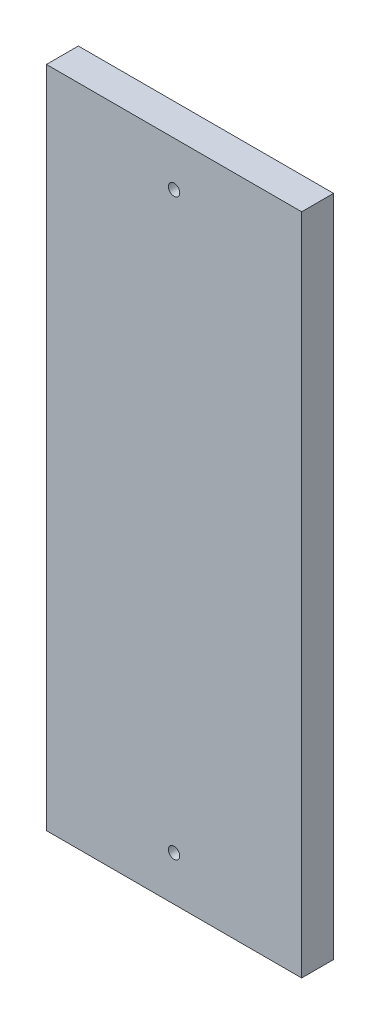
ISO-10303-21;
HEADER;
FILE_DESCRIPTION(('STEP AP214'),'2;1');
FILE_NAME('part.step','',(''),(''),'','','');
FILE_SCHEMA(('AUTOMOTIVE_DESIGN { 1 0 10303 214 1 1 1 1 }'));
ENDSEC;
DATA;
#1=APPLICATION_CONTEXT('core data for automotive mechanical design processes');
#2=APPLICATION_PROTOCOL_DEFINITION('international standard','automotive_design',2000,#1);
#3=PRODUCT_CONTEXT('',#1,'mechanical');
#4=PRODUCT('Part','Part','',(#3));
#5=PRODUCT_RELATED_PRODUCT_CATEGORY('part','',(#4));
#6=PRODUCT_DEFINITION_FORMATION('','',#4);
#7=PRODUCT_DEFINITION_CONTEXT('part definition',#1,'design');
#8=PRODUCT_DEFINITION('design','',#6,#7);
#9=PRODUCT_DEFINITION_SHAPE('','',#8);
#10=(LENGTH_UNIT() NAMED_UNIT(*) SI_UNIT(.MILLI.,.METRE.));
#11=(NAMED_UNIT(*) PLANE_ANGLE_UNIT() SI_UNIT($,.RADIAN.));
#12=(NAMED_UNIT(*) SI_UNIT($,.STERADIAN.) SOLID_ANGLE_UNIT());
#13=UNCERTAINTY_MEASURE_WITH_UNIT(LENGTH_MEASURE(1.E-05),#10,'distance_accuracy_value','');
#14=(GEOMETRIC_REPRESENTATION_CONTEXT(3) GLOBAL_UNCERTAINTY_ASSIGNED_CONTEXT((#13)) GLOBAL_UNIT_ASSIGNED_CONTEXT((#10,
#11,#12)) REPRESENTATION_CONTEXT('',''));
#15=CARTESIAN_POINT('',(0.,0.,0.));
#16=DIRECTION('',(0.,0.,1.));
#17=DIRECTION('',(1.,0.,0.));
#18=AXIS2_PLACEMENT_3D('',#15,#16,#17);
#19=CARTESIAN_POINT('',(25.4000000000001,132.08,-3.175));
#20=DIRECTION('',(-1.,0.,0.));
#21=DIRECTION('',(0.,0.,1.));
#22=AXIS2_PLACEMENT_3D('',#19,#20,#21);
#23=PLANE('',#22);
#24=DIRECTION('',(0.,0.,-1.));
#25=VECTOR('',#24,1.);
#26=CARTESIAN_POINT('',(25.4000000000001,0.,-3.175));
#27=LINE('',#26,#25);
#28=CARTESIAN_POINT('',(25.4000000000001,0.,3.17499999999999));
#29=VERTEX_POINT('',#28);
#30=CARTESIAN_POINT('',(25.4000000000001,0.,-3.175));
#31=VERTEX_POINT('',#30);
#32=EDGE_CURVE('E96',#29,#31,#27,.T.);
#33=ORIENTED_EDGE('',*,*,#32,.T.);
#34=DIRECTION('',(0.,-1.,0.));
#35=VECTOR('',#34,1.);
#36=CARTESIAN_POINT('',(25.4000000000001,132.08,-3.175));
#37=LINE('',#36,#35);
#38=CARTESIAN_POINT('',(25.4000000000001,132.08,-3.175));
#39=VERTEX_POINT('',#38);
#40=EDGE_CURVE('E11',#39,#31,#37,.T.);
#41=ORIENTED_EDGE('',*,*,#40,.F.);
#42=DIRECTION('',(0.,0.,-1.));
#43=VECTOR('',#42,1.);
#44=CARTESIAN_POINT('',(25.4000000000001,132.08,-3.175));
#45=LINE('',#44,#43);
#46=CARTESIAN_POINT('',(25.4000000000001,132.08,3.17499999999999));
#47=VERTEX_POINT('',#46);
#48=EDGE_CURVE('E84',#47,#39,#45,.T.);
#49=ORIENTED_EDGE('',*,*,#48,.F.);
#50=DIRECTION('',(0.,-1.,0.));
#51=VECTOR('',#50,1.);
#52=CARTESIAN_POINT('',(25.4000000000001,132.08,3.17499999999999));
#53=LINE('',#52,#51);
#54=EDGE_CURVE('E92',#47,#29,#53,.T.);
#55=ORIENTED_EDGE('',*,*,#54,.T.);
#56=EDGE_LOOP('',(#33,#41,#49,#55));
#57=FACE_BOUND('',#56,.T.);
#58=ADVANCED_FACE('F33',(#57),#23,.F.);
#59=CARTESIAN_POINT('',(-25.3999999999999,132.08,-3.175));
#60=DIRECTION('',(0.,0.,1.));
#61=DIRECTION('',(1.,0.,0.));
#62=AXIS2_PLACEMENT_3D('',#59,#60,#61);
#63=PLANE('',#62);
#64=CARTESIAN_POINT('',(0.,8.88999999999998,-3.175));
#65=DIRECTION('',(0.,0.,1.));
#66=DIRECTION('',(-1.,0.,0.));
#67=AXIS2_PLACEMENT_3D('',#64,#65,#66);
#68=CIRCLE('',#67,1.1303);
#69=CARTESIAN_POINT('',(-1.13029999999992,8.88999999999998,-3.175));
#70=VERTEX_POINT('',#69);
#71=EDGE_CURVE('E113',#70,#70,#68,.T.);
#72=ORIENTED_EDGE('',*,*,#71,.T.);
#73=EDGE_LOOP('',(#72));
#74=FACE_BOUND('',#73,.T.);
#75=CARTESIAN_POINT('',(0.,123.19,-3.175));
#76=DIRECTION('',(0.,0.,1.));
#77=DIRECTION('',(1.,0.,0.));
#78=AXIS2_PLACEMENT_3D('',#75,#76,#77);
#79=CIRCLE('',#78,1.1303);
#80=CARTESIAN_POINT('',(1.13030000000008,123.19,-3.175));
#81=VERTEX_POINT('',#80);
#82=EDGE_CURVE('E99',#81,#81,#79,.T.);
#83=ORIENTED_EDGE('',*,*,#82,.T.);
#84=EDGE_LOOP('',(#83));
#85=FACE_BOUND('',#84,.T.);
#86=DIRECTION('',(-1.,0.,0.));
#87=VECTOR('',#86,1.);
#88=CARTESIAN_POINT('',(-25.3999999999999,0.,-3.175));
#89=LINE('',#88,#87);
#90=CARTESIAN_POINT('',(-25.3999999999999,0.,-3.175));
#91=VERTEX_POINT('',#90);
#92=EDGE_CURVE('E88',#31,#91,#89,.T.);
#93=ORIENTED_EDGE('',*,*,#92,.T.);
#94=DIRECTION('',(0.,-1.,0.));
#95=VECTOR('',#94,1.);
#96=CARTESIAN_POINT('',(-25.3999999999999,132.08,-3.175));
#97=LINE('',#96,#95);
#98=CARTESIAN_POINT('',(-25.3999999999999,132.08,-3.175));
#99=VERTEX_POINT('',#98);
#100=EDGE_CURVE('E41',#99,#91,#97,.T.);
#101=ORIENTED_EDGE('',*,*,#100,.F.);
#102=DIRECTION('',(-1.,0.,0.));
#103=VECTOR('',#102,1.);
#104=CARTESIAN_POINT('',(-25.3999999999999,132.08,-3.175));
#105=LINE('',#104,#103);
#106=EDGE_CURVE('E79',#39,#99,#105,.T.);
#107=ORIENTED_EDGE('',*,*,#106,.F.);
#108=ORIENTED_EDGE('',*,*,#40,.T.);
#109=EDGE_LOOP('',(#93,#101,#107,#108));
#110=FACE_BOUND('',#109,.T.);
#111=ADVANCED_FACE('F87',(#74,#85,#110),#63,.F.);
#112=CARTESIAN_POINT('',(-25.3999999999999,132.08,-3.175));
#113=DIRECTION('',(1.,0.,0.));
#114=DIRECTION('',(0.,0.,-1.));
#115=AXIS2_PLACEMENT_3D('',#112,#113,#114);
#116=PLANE('',#115);
#117=DIRECTION('',(0.,0.,1.));
#118=VECTOR('',#117,1.);
#119=CARTESIAN_POINT('',(-25.3999999999999,0.,-3.175));
#120=LINE('',#119,#118);
#121=CARTESIAN_POINT('',(-25.3999999999999,0.,3.17499999999999));
#122=VERTEX_POINT('',#121);
#123=EDGE_CURVE('E66',#91,#122,#120,.T.);
#124=ORIENTED_EDGE('',*,*,#123,.T.);
#125=DIRECTION('',(0.,-1.,0.));
#126=VECTOR('',#125,1.);
#127=CARTESIAN_POINT('',(-25.3999999999999,132.08,3.17499999999999));
#128=LINE('',#127,#126);
#129=CARTESIAN_POINT('',(-25.3999999999999,132.08,3.17499999999999));
#130=VERTEX_POINT('',#129);
#131=EDGE_CURVE('E89',#130,#122,#128,.T.);
#132=ORIENTED_EDGE('',*,*,#131,.F.);
#133=DIRECTION('',(0.,0.,1.));
#134=VECTOR('',#133,1.);
#135=CARTESIAN_POINT('',(-25.3999999999999,132.08,-3.175));
#136=LINE('',#135,#134);
#137=EDGE_CURVE('E82',#99,#130,#136,.T.);
#138=ORIENTED_EDGE('',*,*,#137,.F.);
#139=ORIENTED_EDGE('',*,*,#100,.T.);
#140=EDGE_LOOP('',(#124,#132,#138,#139));
#141=FACE_BOUND('',#140,.T.);
#142=ADVANCED_FACE('F90',(#141),#116,.F.);
#143=CARTESIAN_POINT('',(-25.3999999999999,132.08,3.17499999999999));
#144=DIRECTION('',(0.,0.,-1.));
#145=DIRECTION('',(-1.,0.,0.));
#146=AXIS2_PLACEMENT_3D('',#143,#144,#145);
#147=PLANE('',#146);
#148=CARTESIAN_POINT('',(0.,8.88999999999998,3.17499999999999));
#149=DIRECTION('',(0.,0.,1.));
#150=DIRECTION('',(-1.,0.,0.));
#151=AXIS2_PLACEMENT_3D('',#148,#149,#150);
#152=CIRCLE('',#151,1.1303);
#153=CARTESIAN_POINT('',(-1.13029999999992,8.88999999999998,3.17499999999999));
#154=VERTEX_POINT('',#153);
#155=EDGE_CURVE('E116',#154,#154,#152,.T.);
#156=ORIENTED_EDGE('',*,*,#155,.F.);
#157=EDGE_LOOP('',(#156));
#158=FACE_BOUND('',#157,.T.);
#159=CARTESIAN_POINT('',(0.,123.19,3.17499999999999));
#160=DIRECTION('',(0.,0.,1.));
#161=DIRECTION('',(1.,0.,0.));
#162=AXIS2_PLACEMENT_3D('',#159,#160,#161);
#163=CIRCLE('',#162,1.1303);
#164=CARTESIAN_POINT('',(1.13030000000008,123.19,3.17499999999999));
#165=VERTEX_POINT('',#164);
#166=EDGE_CURVE('E110',#165,#165,#163,.T.);
#167=ORIENTED_EDGE('',*,*,#166,.F.);
#168=EDGE_LOOP('',(#167));
#169=FACE_BOUND('',#168,.T.);
#170=DIRECTION('',(1.,0.,0.));
#171=VECTOR('',#170,1.);
#172=CARTESIAN_POINT('',(-25.3999999999999,0.,3.17499999999999));
#173=LINE('',#172,#171);
#174=EDGE_CURVE('E72',#122,#29,#173,.T.);
#175=ORIENTED_EDGE('',*,*,#174,.T.);
#176=ORIENTED_EDGE('',*,*,#54,.F.);
#177=DIRECTION('',(1.,0.,0.));
#178=VECTOR('',#177,1.);
#179=CARTESIAN_POINT('',(-25.3999999999999,132.08,3.17499999999999));
#180=LINE('',#179,#178);
#181=EDGE_CURVE('E49',#130,#47,#180,.T.);
#182=ORIENTED_EDGE('',*,*,#181,.F.);
#183=ORIENTED_EDGE('',*,*,#131,.T.);
#184=EDGE_LOOP('',(#175,#176,#182,#183));
#185=FACE_BOUND('',#184,.T.);
#186=ADVANCED_FACE('F104',(#158,#169,#185),#147,.F.);
#187=CARTESIAN_POINT('',(0.,132.08,0.));
#188=DIRECTION('',(0.,1.,0.));
#189=DIRECTION('',(0.,0.,1.));
#190=AXIS2_PLACEMENT_3D('',#187,#188,#189);
#191=PLANE('',#190);
#192=ORIENTED_EDGE('',*,*,#48,.T.);
#193=ORIENTED_EDGE('',*,*,#106,.T.);
#194=ORIENTED_EDGE('',*,*,#137,.T.);
#195=ORIENTED_EDGE('',*,*,#181,.T.);
#196=EDGE_LOOP('',(#192,#193,#194,#195));
#197=FACE_BOUND('',#196,.T.);
#198=ADVANCED_FACE('F80',(#197),#191,.T.);
#199=CARTESIAN_POINT('',(0.,0.,0.));
#200=DIRECTION('',(0.,1.,0.));
#201=DIRECTION('',(0.,0.,1.));
#202=AXIS2_PLACEMENT_3D('',#199,#200,#201);
#203=PLANE('',#202);
#204=ORIENTED_EDGE('',*,*,#32,.F.);
#205=ORIENTED_EDGE('',*,*,#174,.F.);
#206=ORIENTED_EDGE('',*,*,#123,.F.);
#207=ORIENTED_EDGE('',*,*,#92,.F.);
#208=EDGE_LOOP('',(#204,#205,#206,#207));
#209=FACE_BOUND('',#208,.T.);
#210=ADVANCED_FACE('F107',(#209),#203,.F.);
#211=CARTESIAN_POINT('',(0.,123.19,-3.175));
#212=DIRECTION('',(0.,0.,1.));
#213=DIRECTION('',(1.,0.,0.));
#214=AXIS2_PLACEMENT_3D('',#211,#212,#213);
#215=CYLINDRICAL_SURFACE('',#214,1.1303);
#216=ORIENTED_EDGE('',*,*,#82,.F.);
#217=EDGE_LOOP('',(#216));
#218=FACE_BOUND('',#217,.T.);
#219=ORIENTED_EDGE('',*,*,#166,.T.);
#220=EDGE_LOOP('',(#219));
#221=FACE_BOUND('',#220,.T.);
#222=ADVANCED_FACE('F127',(#218,#221),#215,.F.);
#223=CARTESIAN_POINT('',(0.,8.88999999999998,-3.175));
#224=DIRECTION('',(0.,0.,1.));
#225=DIRECTION('',(1.,0.,0.));
#226=AXIS2_PLACEMENT_3D('',#223,#224,#225);
#227=CYLINDRICAL_SURFACE('',#226,1.1303);
#228=ORIENTED_EDGE('',*,*,#71,.F.);
#229=EDGE_LOOP('',(#228));
#230=FACE_BOUND('',#229,.T.);
#231=ORIENTED_EDGE('',*,*,#155,.T.);
#232=EDGE_LOOP('',(#231));
#233=FACE_BOUND('',#232,.T.);
#234=ADVANCED_FACE('F124',(#230,#233),#227,.F.);
#235=CLOSED_SHELL('',(#58,#111,#142,#186,#198,#210,#222,#234));
#236=MANIFOLD_SOLID_BREP('B2',#235);
#237=ADVANCED_BREP_SHAPE_REPRESENTATION('',(#18,#236),#14);
#238=SHAPE_DEFINITION_REPRESENTATION(#9,#237);
ENDSEC;
END-ISO-10303-21;
